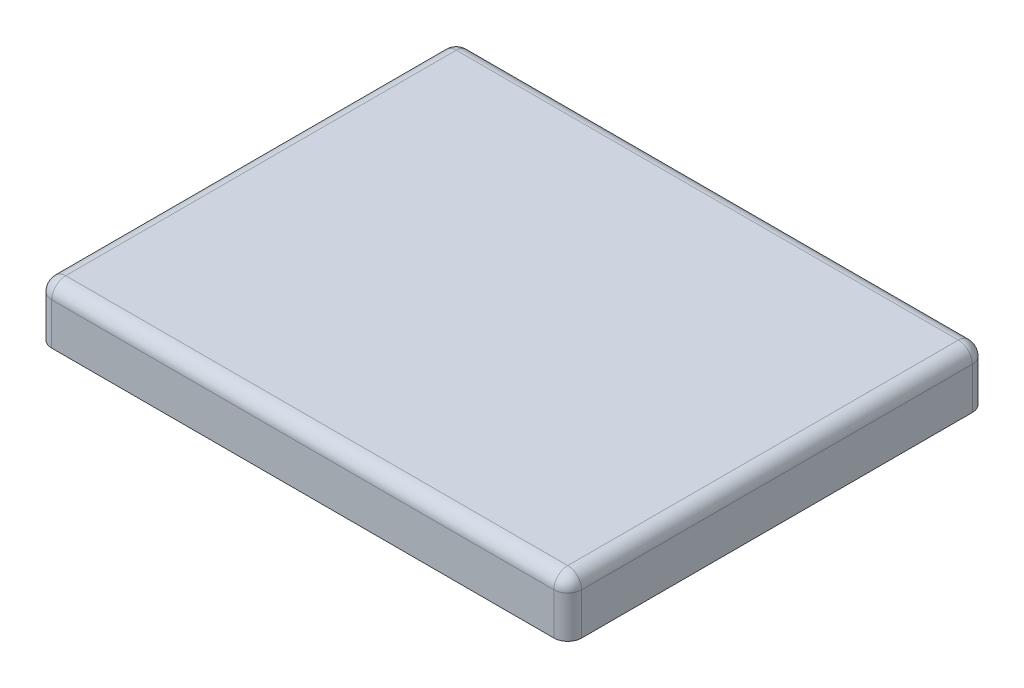
ISO-10303-21;
HEADER;
FILE_DESCRIPTION(('STEP AP214'),'2;1');
FILE_NAME('part.step','',(''),(''),'','','');
FILE_SCHEMA(('AUTOMOTIVE_DESIGN { 1 0 10303 214 1 1 1 1 }'));
ENDSEC;
DATA;
#1=APPLICATION_CONTEXT('core data for automotive mechanical design processes');
#2=APPLICATION_PROTOCOL_DEFINITION('international standard','automotive_design',2000,#1);
#3=PRODUCT_CONTEXT('',#1,'mechanical');
#4=PRODUCT('Part','Part','',(#3));
#5=PRODUCT_RELATED_PRODUCT_CATEGORY('part','',(#4));
#6=PRODUCT_DEFINITION_FORMATION('','',#4);
#7=PRODUCT_DEFINITION_CONTEXT('part definition',#1,'design');
#8=PRODUCT_DEFINITION('design','',#6,#7);
#9=PRODUCT_DEFINITION_SHAPE('','',#8);
#10=(LENGTH_UNIT() NAMED_UNIT(*) SI_UNIT(.MILLI.,.METRE.));
#11=(NAMED_UNIT(*) PLANE_ANGLE_UNIT() SI_UNIT($,.RADIAN.));
#12=(NAMED_UNIT(*) SI_UNIT($,.STERADIAN.) SOLID_ANGLE_UNIT());
#13=UNCERTAINTY_MEASURE_WITH_UNIT(LENGTH_MEASURE(1.E-05),#10,'distance_accuracy_value','');
#14=(GEOMETRIC_REPRESENTATION_CONTEXT(3) GLOBAL_UNCERTAINTY_ASSIGNED_CONTEXT((#13)) GLOBAL_UNIT_ASSIGNED_CONTEXT((#10,
#11,#12)) REPRESENTATION_CONTEXT('',''));
#15=CARTESIAN_POINT('',(0.,0.,0.));
#16=DIRECTION('',(0.,0.,1.));
#17=DIRECTION('',(1.,0.,0.));
#18=AXIS2_PLACEMENT_3D('',#15,#16,#17);
#19=CARTESIAN_POINT('',(0.,50.8,0.));
#20=DIRECTION('',(1.,0.,0.));
#21=DIRECTION('',(0.,0.,-1.));
#22=AXIS2_PLACEMENT_3D('',#19,#20,#21);
#23=PLANE('',#22);
#24=DIRECTION('',(0.,0.,1.));
#25=VECTOR('',#24,1.);
#26=CARTESIAN_POINT('',(0.,38.1,0.));
#27=LINE('',#26,#25);
#28=CARTESIAN_POINT('',(0.,38.1,-12.7));
#29=VERTEX_POINT('',#28);
#30=CARTESIAN_POINT('',(0.,38.1,-368.3));
#31=VERTEX_POINT('',#30);
#32=EDGE_CURVE('E128',#29,#31,#27,.F.);
#33=ORIENTED_EDGE('',*,*,#32,.T.);
#34=DIRECTION('',(0.,-1.,0.));
#35=VECTOR('',#34,1.);
#36=CARTESIAN_POINT('',(0.,50.8,-368.3));
#37=LINE('',#36,#35);
#38=CARTESIAN_POINT('',(0.,0.,-368.3));
#39=VERTEX_POINT('',#38);
#40=EDGE_CURVE('E114',#31,#39,#37,.T.);
#41=ORIENTED_EDGE('',*,*,#40,.T.);
#42=DIRECTION('',(0.,0.,1.));
#43=VECTOR('',#42,1.);
#44=CARTESIAN_POINT('',(0.,0.,0.));
#45=LINE('',#44,#43);
#46=CARTESIAN_POINT('',(0.,0.,-12.7));
#47=VERTEX_POINT('',#46);
#48=EDGE_CURVE('E125',#39,#47,#45,.T.);
#49=ORIENTED_EDGE('',*,*,#48,.T.);
#50=DIRECTION('',(0.,-1.,0.));
#51=VECTOR('',#50,1.);
#52=CARTESIAN_POINT('',(0.,50.8,-12.7));
#53=LINE('',#52,#51);
#54=EDGE_CURVE('E147',#47,#29,#53,.F.);
#55=ORIENTED_EDGE('',*,*,#54,.T.);
#56=EDGE_LOOP('',(#33,#41,#49,#55));
#57=FACE_BOUND('',#56,.T.);
#58=ADVANCED_FACE('F33',(#57),#23,.F.);
#59=CARTESIAN_POINT('',(0.,50.8,0.));
#60=DIRECTION('',(0.,0.,-1.));
#61=DIRECTION('',(-1.,0.,0.));
#62=AXIS2_PLACEMENT_3D('',#59,#60,#61);
#63=PLANE('',#62);
#64=DIRECTION('',(1.,0.,0.));
#65=VECTOR('',#64,1.);
#66=CARTESIAN_POINT('',(0.,38.1,0.));
#67=LINE('',#66,#65);
#68=CARTESIAN_POINT('',(469.9,38.1,0.));
#69=VERTEX_POINT('',#68);
#70=CARTESIAN_POINT('',(12.7,38.1,0.));
#71=VERTEX_POINT('',#70);
#72=EDGE_CURVE('E42',#69,#71,#67,.F.);
#73=ORIENTED_EDGE('',*,*,#72,.T.);
#74=DIRECTION('',(0.,-1.,0.));
#75=VECTOR('',#74,1.);
#76=CARTESIAN_POINT('',(12.7,50.8,0.));
#77=LINE('',#76,#75);
#78=CARTESIAN_POINT('',(12.7,0.,0.));
#79=VERTEX_POINT('',#78);
#80=EDGE_CURVE('E11',#71,#79,#77,.T.);
#81=ORIENTED_EDGE('',*,*,#80,.T.);
#82=DIRECTION('',(1.,0.,0.));
#83=VECTOR('',#82,1.);
#84=CARTESIAN_POINT('',(0.,0.,0.));
#85=LINE('',#84,#83);
#86=CARTESIAN_POINT('',(469.9,0.,0.));
#87=VERTEX_POINT('',#86);
#88=EDGE_CURVE('E136',#79,#87,#85,.T.);
#89=ORIENTED_EDGE('',*,*,#88,.T.);
#90=DIRECTION('',(0.,-1.,0.));
#91=VECTOR('',#90,1.);
#92=CARTESIAN_POINT('',(469.9,50.8,0.));
#93=LINE('',#92,#91);
#94=EDGE_CURVE('E53',#87,#69,#93,.F.);
#95=ORIENTED_EDGE('',*,*,#94,.T.);
#96=EDGE_LOOP('',(#73,#81,#89,#95));
#97=FACE_BOUND('',#96,.T.);
#98=ADVANCED_FACE('F244',(#97),#63,.F.);
#99=CARTESIAN_POINT('',(482.6,50.8,0.));
#100=DIRECTION('',(-1.,0.,0.));
#101=DIRECTION('',(0.,0.,1.));
#102=AXIS2_PLACEMENT_3D('',#99,#100,#101);
#103=PLANE('',#102);
#104=DIRECTION('',(0.,0.,-1.));
#105=VECTOR('',#104,1.);
#106=CARTESIAN_POINT('',(482.6,0.,0.));
#107=LINE('',#106,#105);
#108=CARTESIAN_POINT('',(482.6,0.,-12.7));
#109=VERTEX_POINT('',#108);
#110=CARTESIAN_POINT('',(482.6,0.,-368.3));
#111=VERTEX_POINT('',#110);
#112=EDGE_CURVE('E138',#109,#111,#107,.T.);
#113=ORIENTED_EDGE('',*,*,#112,.T.);
#114=DIRECTION('',(0.,-1.,0.));
#115=VECTOR('',#114,1.);
#116=CARTESIAN_POINT('',(482.6,50.8,-368.3));
#117=LINE('',#116,#115);
#118=CARTESIAN_POINT('',(482.6,38.1,-368.3));
#119=VERTEX_POINT('',#118);
#120=EDGE_CURVE('E161',#111,#119,#117,.F.);
#121=ORIENTED_EDGE('',*,*,#120,.T.);
#122=DIRECTION('',(0.,0.,-1.));
#123=VECTOR('',#122,1.);
#124=CARTESIAN_POINT('',(482.6,38.1,0.));
#125=LINE('',#124,#123);
#126=CARTESIAN_POINT('',(482.6,38.1,-12.7));
#127=VERTEX_POINT('',#126);
#128=EDGE_CURVE('E159',#119,#127,#125,.F.);
#129=ORIENTED_EDGE('',*,*,#128,.T.);
#130=DIRECTION('',(0.,-1.,0.));
#131=VECTOR('',#130,1.);
#132=CARTESIAN_POINT('',(482.6,50.8,-12.7));
#133=LINE('',#132,#131);
#134=EDGE_CURVE('E157',#127,#109,#133,.T.);
#135=ORIENTED_EDGE('',*,*,#134,.T.);
#136=EDGE_LOOP('',(#113,#121,#129,#135));
#137=FACE_BOUND('',#136,.T.);
#138=ADVANCED_FACE('F217',(#137),#103,.F.);
#139=CARTESIAN_POINT('',(0.,50.8,-381.));
#140=DIRECTION('',(0.,0.,1.));
#141=DIRECTION('',(1.,0.,0.));
#142=AXIS2_PLACEMENT_3D('',#139,#140,#141);
#143=PLANE('',#142);
#144=DIRECTION('',(-1.,0.,0.));
#145=VECTOR('',#144,1.);
#146=CARTESIAN_POINT('',(0.,0.,-381.));
#147=LINE('',#146,#145);
#148=CARTESIAN_POINT('',(469.9,0.,-381.));
#149=VERTEX_POINT('',#148);
#150=CARTESIAN_POINT('',(12.7,0.,-381.));
#151=VERTEX_POINT('',#150);
#152=EDGE_CURVE('E145',#149,#151,#147,.T.);
#153=ORIENTED_EDGE('',*,*,#152,.T.);
#154=DIRECTION('',(0.,-1.,0.));
#155=VECTOR('',#154,1.);
#156=CARTESIAN_POINT('',(12.7,50.8,-381.));
#157=LINE('',#156,#155);
#158=CARTESIAN_POINT('',(12.7,38.1,-381.));
#159=VERTEX_POINT('',#158);
#160=EDGE_CURVE('E115',#151,#159,#157,.F.);
#161=ORIENTED_EDGE('',*,*,#160,.T.);
#162=DIRECTION('',(-1.,0.,0.));
#163=VECTOR('',#162,1.);
#164=CARTESIAN_POINT('',(0.,38.1,-381.));
#165=LINE('',#164,#163);
#166=CARTESIAN_POINT('',(469.9,38.1,-381.));
#167=VERTEX_POINT('',#166);
#168=EDGE_CURVE('E120',#159,#167,#165,.F.);
#169=ORIENTED_EDGE('',*,*,#168,.T.);
#170=DIRECTION('',(0.,-1.,0.));
#171=VECTOR('',#170,1.);
#172=CARTESIAN_POINT('',(469.9,50.8,-381.));
#173=LINE('',#172,#171);
#174=EDGE_CURVE('E154',#167,#149,#173,.T.);
#175=ORIENTED_EDGE('',*,*,#174,.T.);
#176=EDGE_LOOP('',(#153,#161,#169,#175));
#177=FACE_BOUND('',#176,.T.);
#178=ADVANCED_FACE('F251',(#177),#143,.F.);
#179=CARTESIAN_POINT('',(0.,50.8,-381.));
#180=DIRECTION('',(0.,-1.,0.));
#181=DIRECTION('',(0.,0.,-1.));
#182=AXIS2_PLACEMENT_3D('',#179,#180,#181);
#183=PLANE('',#182);
#184=DIRECTION('',(0.,0.,-1.));
#185=VECTOR('',#184,1.);
#186=CARTESIAN_POINT('',(469.9,50.8,-381.));
#187=LINE('',#186,#185);
#188=CARTESIAN_POINT('',(469.9,50.8,-12.7));
#189=VERTEX_POINT('',#188);
#190=CARTESIAN_POINT('',(469.9,50.8,-368.3));
#191=VERTEX_POINT('',#190);
#192=EDGE_CURVE('E163',#189,#191,#187,.T.);
#193=ORIENTED_EDGE('',*,*,#192,.T.);
#194=DIRECTION('',(-1.,0.,0.));
#195=VECTOR('',#194,1.);
#196=CARTESIAN_POINT('',(0.,50.8,-368.3));
#197=LINE('',#196,#195);
#198=CARTESIAN_POINT('',(12.7,50.8,-368.3));
#199=VERTEX_POINT('',#198);
#200=EDGE_CURVE('E169',#191,#199,#197,.T.);
#201=ORIENTED_EDGE('',*,*,#200,.T.);
#202=DIRECTION('',(0.,0.,1.));
#203=VECTOR('',#202,1.);
#204=CARTESIAN_POINT('',(12.7,50.8,-381.));
#205=LINE('',#204,#203);
#206=CARTESIAN_POINT('',(12.7,50.8,-12.7));
#207=VERTEX_POINT('',#206);
#208=EDGE_CURVE('E167',#199,#207,#205,.T.);
#209=ORIENTED_EDGE('',*,*,#208,.T.);
#210=DIRECTION('',(1.,0.,0.));
#211=VECTOR('',#210,1.);
#212=CARTESIAN_POINT('',(0.,50.8,-12.7));
#213=LINE('',#212,#211);
#214=EDGE_CURVE('E165',#207,#189,#213,.T.);
#215=ORIENTED_EDGE('',*,*,#214,.T.);
#216=EDGE_LOOP('',(#193,#201,#209,#215));
#217=FACE_BOUND('',#216,.T.);
#218=ADVANCED_FACE('F233',(#217),#183,.F.);
#219=CARTESIAN_POINT('',(0.,0.,-381.));
#220=DIRECTION('',(0.,-1.,0.));
#221=DIRECTION('',(0.,0.,-1.));
#222=AXIS2_PLACEMENT_3D('',#219,#220,#221);
#223=PLANE('',#222);
#224=ORIENTED_EDGE('',*,*,#48,.F.);
#225=CARTESIAN_POINT('',(12.7,0.,-368.3));
#226=DIRECTION('',(0.,-1.,0.));
#227=DIRECTION('',(0.,0.,-1.));
#228=AXIS2_PLACEMENT_3D('',#225,#226,#227);
#229=CIRCLE('',#228,12.7);
#230=EDGE_CURVE('E110',#39,#151,#229,.T.);
#231=ORIENTED_EDGE('',*,*,#230,.T.);
#232=ORIENTED_EDGE('',*,*,#152,.F.);
#233=CARTESIAN_POINT('',(469.9,0.,-368.3));
#234=DIRECTION('',(0.,-1.,0.));
#235=DIRECTION('',(0.,0.,-1.));
#236=AXIS2_PLACEMENT_3D('',#233,#234,#235);
#237=CIRCLE('',#236,12.7);
#238=EDGE_CURVE('E121',#149,#111,#237,.T.);
#239=ORIENTED_EDGE('',*,*,#238,.T.);
#240=ORIENTED_EDGE('',*,*,#112,.F.);
#241=CARTESIAN_POINT('',(469.9,0.,-12.7));
#242=DIRECTION('',(0.,-1.,0.));
#243=DIRECTION('',(0.,0.,-1.));
#244=AXIS2_PLACEMENT_3D('',#241,#242,#243);
#245=CIRCLE('',#244,12.7);
#246=EDGE_CURVE('E130',#109,#87,#245,.T.);
#247=ORIENTED_EDGE('',*,*,#246,.T.);
#248=ORIENTED_EDGE('',*,*,#88,.F.);
#249=CARTESIAN_POINT('',(12.7,0.,-12.7));
#250=DIRECTION('',(0.,-1.,0.));
#251=DIRECTION('',(0.,0.,-1.));
#252=AXIS2_PLACEMENT_3D('',#249,#250,#251);
#253=CIRCLE('',#252,12.7);
#254=EDGE_CURVE('E135',#79,#47,#253,.T.);
#255=ORIENTED_EDGE('',*,*,#254,.T.);
#256=EDGE_LOOP('',(#224,#231,#232,#239,#240,#247,#248,#255));
#257=FACE_BOUND('',#256,.T.);
#258=ADVANCED_FACE('F132',(#257),#223,.T.);
#259=CARTESIAN_POINT('',(469.9,50.8,-12.7));
#260=DIRECTION('',(0.,-1.,0.));
#261=DIRECTION('',(0.,0.,-1.));
#262=AXIS2_PLACEMENT_3D('',#259,#260,#261);
#263=CYLINDRICAL_SURFACE('',#262,12.7);
#264=CARTESIAN_POINT('',(469.9,38.1,-12.7));
#265=DIRECTION('',(0.,1.,0.));
#266=DIRECTION('',(0.,0.,1.));
#267=AXIS2_PLACEMENT_3D('',#264,#265,#266);
#268=CIRCLE('',#267,12.7);
#269=EDGE_CURVE('E37',#69,#127,#268,.T.);
#270=ORIENTED_EDGE('',*,*,#269,.F.);
#271=ORIENTED_EDGE('',*,*,#94,.F.);
#272=ORIENTED_EDGE('',*,*,#246,.F.);
#273=ORIENTED_EDGE('',*,*,#134,.F.);
#274=EDGE_LOOP('',(#270,#271,#272,#273));
#275=FACE_BOUND('',#274,.T.);
#276=ADVANCED_FACE('F35',(#275),#263,.T.);
#277=CARTESIAN_POINT('',(469.9,38.1,-12.7));
#278=DIRECTION('',(0.,0.,1.));
#279=DIRECTION('',(1.,0.,0.));
#280=AXIS2_PLACEMENT_3D('',#277,#278,#279);
#281=SPHERICAL_SURFACE('',#280,12.7);
#282=CARTESIAN_POINT('',(469.9,38.1,-12.7));
#283=DIRECTION('',(1.,0.,0.));
#284=DIRECTION('',(0.,0.,-1.));
#285=AXIS2_PLACEMENT_3D('',#282,#283,#284);
#286=CIRCLE('',#285,12.7);
#287=EDGE_CURVE('E199',#69,#189,#286,.F.);
#288=ORIENTED_EDGE('',*,*,#287,.F.);
#289=ORIENTED_EDGE('',*,*,#269,.T.);
#290=CARTESIAN_POINT('',(469.9,38.1,-12.7));
#291=DIRECTION('',(0.,0.,1.));
#292=DIRECTION('',(0.,-1.,0.));
#293=AXIS2_PLACEMENT_3D('',#290,#291,#292);
#294=CIRCLE('',#293,12.7);
#295=EDGE_CURVE('E141',#189,#127,#294,.F.);
#296=ORIENTED_EDGE('',*,*,#295,.F.);
#297=EDGE_LOOP('',(#288,#289,#296));
#298=FACE_BOUND('',#297,.T.);
#299=ADVANCED_FACE('F211',(#298),#281,.T.);
#300=CARTESIAN_POINT('',(469.9,50.8,-368.3));
#301=DIRECTION('',(0.,-1.,0.));
#302=DIRECTION('',(0.,0.,-1.));
#303=AXIS2_PLACEMENT_3D('',#300,#301,#302);
#304=CYLINDRICAL_SURFACE('',#303,12.7);
#305=ORIENTED_EDGE('',*,*,#238,.F.);
#306=ORIENTED_EDGE('',*,*,#174,.F.);
#307=CARTESIAN_POINT('',(469.9,38.1,-368.3));
#308=DIRECTION('',(0.,1.,0.));
#309=DIRECTION('',(0.,0.,1.));
#310=AXIS2_PLACEMENT_3D('',#307,#308,#309);
#311=CIRCLE('',#310,12.7);
#312=EDGE_CURVE('E196',#119,#167,#311,.T.);
#313=ORIENTED_EDGE('',*,*,#312,.F.);
#314=ORIENTED_EDGE('',*,*,#120,.F.);
#315=EDGE_LOOP('',(#305,#306,#313,#314));
#316=FACE_BOUND('',#315,.T.);
#317=ADVANCED_FACE('F222',(#316),#304,.T.);
#318=CARTESIAN_POINT('',(469.9,38.1,-381.));
#319=DIRECTION('',(0.,0.,-1.));
#320=DIRECTION('',(-1.,0.,0.));
#321=AXIS2_PLACEMENT_3D('',#318,#319,#320);
#322=CYLINDRICAL_SURFACE('',#321,12.7);
#323=ORIENTED_EDGE('',*,*,#295,.T.);
#324=ORIENTED_EDGE('',*,*,#128,.F.);
#325=CARTESIAN_POINT('',(469.9,38.1,-368.3));
#326=DIRECTION('',(0.,0.,-1.));
#327=DIRECTION('',(-1.,0.,0.));
#328=AXIS2_PLACEMENT_3D('',#325,#326,#327);
#329=CIRCLE('',#328,12.7);
#330=EDGE_CURVE('E193',#191,#119,#329,.T.);
#331=ORIENTED_EDGE('',*,*,#330,.F.);
#332=ORIENTED_EDGE('',*,*,#192,.F.);
#333=EDGE_LOOP('',(#323,#324,#331,#332));
#334=FACE_BOUND('',#333,.T.);
#335=ADVANCED_FACE('F206',(#334),#322,.T.);
#336=CARTESIAN_POINT('',(0.,38.1,-12.7));
#337=DIRECTION('',(1.,0.,0.));
#338=DIRECTION('',(0.,0.,-1.));
#339=AXIS2_PLACEMENT_3D('',#336,#337,#338);
#340=CYLINDRICAL_SURFACE('',#339,12.7);
#341=ORIENTED_EDGE('',*,*,#287,.T.);
#342=ORIENTED_EDGE('',*,*,#214,.F.);
#343=CARTESIAN_POINT('',(12.7,38.1,-12.7));
#344=DIRECTION('',(-1.,0.,0.));
#345=DIRECTION('',(0.,0.,1.));
#346=AXIS2_PLACEMENT_3D('',#343,#344,#345);
#347=CIRCLE('',#346,12.7);
#348=EDGE_CURVE('E190',#71,#207,#347,.T.);
#349=ORIENTED_EDGE('',*,*,#348,.F.);
#350=ORIENTED_EDGE('',*,*,#72,.F.);
#351=EDGE_LOOP('',(#341,#342,#349,#350));
#352=FACE_BOUND('',#351,.T.);
#353=ADVANCED_FACE('F237',(#352),#340,.T.);
#354=CARTESIAN_POINT('',(12.7,50.8,-12.7));
#355=DIRECTION('',(0.,-1.,0.));
#356=DIRECTION('',(0.,0.,-1.));
#357=AXIS2_PLACEMENT_3D('',#354,#355,#356);
#358=CYLINDRICAL_SURFACE('',#357,12.7);
#359=ORIENTED_EDGE('',*,*,#254,.F.);
#360=ORIENTED_EDGE('',*,*,#80,.F.);
#361=CARTESIAN_POINT('',(12.7,38.1,-12.7));
#362=DIRECTION('',(0.,1.,0.));
#363=DIRECTION('',(0.,0.,1.));
#364=AXIS2_PLACEMENT_3D('',#361,#362,#363);
#365=CIRCLE('',#364,12.7);
#366=EDGE_CURVE('E187',#29,#71,#365,.T.);
#367=ORIENTED_EDGE('',*,*,#366,.F.);
#368=ORIENTED_EDGE('',*,*,#54,.F.);
#369=EDGE_LOOP('',(#359,#360,#367,#368));
#370=FACE_BOUND('',#369,.T.);
#371=ADVANCED_FACE('F243',(#370),#358,.T.);
#372=CARTESIAN_POINT('',(469.9,38.1,-368.3));
#373=DIRECTION('',(0.,0.,1.));
#374=DIRECTION('',(1.,0.,0.));
#375=AXIS2_PLACEMENT_3D('',#372,#373,#374);
#376=SPHERICAL_SURFACE('',#375,12.7);
#377=ORIENTED_EDGE('',*,*,#330,.T.);
#378=ORIENTED_EDGE('',*,*,#312,.T.);
#379=CARTESIAN_POINT('',(469.9,38.1,-368.3));
#380=DIRECTION('',(1.,0.,0.));
#381=DIRECTION('',(0.,0.,-1.));
#382=AXIS2_PLACEMENT_3D('',#379,#380,#381);
#383=CIRCLE('',#382,12.7);
#384=EDGE_CURVE('E184',#191,#167,#383,.F.);
#385=ORIENTED_EDGE('',*,*,#384,.F.);
#386=EDGE_LOOP('',(#377,#378,#385));
#387=FACE_BOUND('',#386,.T.);
#388=ADVANCED_FACE('F225',(#387),#376,.T.);
#389=CARTESIAN_POINT('',(12.7,38.1,-12.7));
#390=DIRECTION('',(0.,0.,1.));
#391=DIRECTION('',(1.,0.,0.));
#392=AXIS2_PLACEMENT_3D('',#389,#390,#391);
#393=SPHERICAL_SURFACE('',#392,12.7);
#394=ORIENTED_EDGE('',*,*,#366,.T.);
#395=ORIENTED_EDGE('',*,*,#348,.T.);
#396=CARTESIAN_POINT('',(12.7,38.1,-12.7));
#397=DIRECTION('',(0.,0.,1.));
#398=DIRECTION('',(1.,0.,0.));
#399=AXIS2_PLACEMENT_3D('',#396,#397,#398);
#400=CIRCLE('',#399,12.7);
#401=EDGE_CURVE('E181',#29,#207,#400,.F.);
#402=ORIENTED_EDGE('',*,*,#401,.F.);
#403=EDGE_LOOP('',(#394,#395,#402));
#404=FACE_BOUND('',#403,.T.);
#405=ADVANCED_FACE('F241',(#404),#393,.T.);
#406=CARTESIAN_POINT('',(0.,38.1,-368.3));
#407=DIRECTION('',(-1.,0.,0.));
#408=DIRECTION('',(0.,0.,1.));
#409=AXIS2_PLACEMENT_3D('',#406,#407,#408);
#410=CYLINDRICAL_SURFACE('',#409,12.7);
#411=ORIENTED_EDGE('',*,*,#384,.T.);
#412=ORIENTED_EDGE('',*,*,#168,.F.);
#413=CARTESIAN_POINT('',(12.7,38.1,-368.3));
#414=DIRECTION('',(-1.,0.,0.));
#415=DIRECTION('',(0.,0.,1.));
#416=AXIS2_PLACEMENT_3D('',#413,#414,#415);
#417=CIRCLE('',#416,12.7);
#418=EDGE_CURVE('E178',#199,#159,#417,.T.);
#419=ORIENTED_EDGE('',*,*,#418,.F.);
#420=ORIENTED_EDGE('',*,*,#200,.F.);
#421=EDGE_LOOP('',(#411,#412,#419,#420));
#422=FACE_BOUND('',#421,.T.);
#423=ADVANCED_FACE('F230',(#422),#410,.T.);
#424=CARTESIAN_POINT('',(12.7,38.1,-381.));
#425=DIRECTION('',(0.,0.,1.));
#426=DIRECTION('',(1.,0.,0.));
#427=AXIS2_PLACEMENT_3D('',#424,#425,#426);
#428=CYLINDRICAL_SURFACE('',#427,12.7);
#429=ORIENTED_EDGE('',*,*,#401,.T.);
#430=ORIENTED_EDGE('',*,*,#208,.F.);
#431=CARTESIAN_POINT('',(12.7,38.1,-368.3));
#432=DIRECTION('',(0.,0.,-1.));
#433=DIRECTION('',(-1.,0.,0.));
#434=AXIS2_PLACEMENT_3D('',#431,#432,#433);
#435=CIRCLE('',#434,12.7);
#436=EDGE_CURVE('E176',#31,#199,#435,.T.);
#437=ORIENTED_EDGE('',*,*,#436,.F.);
#438=ORIENTED_EDGE('',*,*,#32,.F.);
#439=EDGE_LOOP('',(#429,#430,#437,#438));
#440=FACE_BOUND('',#439,.T.);
#441=ADVANCED_FACE('F261',(#440),#428,.T.);
#442=CARTESIAN_POINT('',(12.7,38.1,-368.3));
#443=DIRECTION('',(0.,0.,1.));
#444=DIRECTION('',(1.,0.,0.));
#445=AXIS2_PLACEMENT_3D('',#442,#443,#444);
#446=SPHERICAL_SURFACE('',#445,12.7);
#447=ORIENTED_EDGE('',*,*,#436,.T.);
#448=ORIENTED_EDGE('',*,*,#418,.T.);
#449=CARTESIAN_POINT('',(12.7,38.1,-368.3));
#450=DIRECTION('',(0.,1.,0.));
#451=DIRECTION('',(0.,0.,1.));
#452=AXIS2_PLACEMENT_3D('',#449,#450,#451);
#453=CIRCLE('',#452,12.7);
#454=EDGE_CURVE('E174',#31,#159,#453,.F.);
#455=ORIENTED_EDGE('',*,*,#454,.F.);
#456=EDGE_LOOP('',(#447,#448,#455));
#457=FACE_BOUND('',#456,.T.);
#458=ADVANCED_FACE('F258',(#457),#446,.T.);
#459=CARTESIAN_POINT('',(12.7,50.8,-368.3));
#460=DIRECTION('',(0.,-1.,0.));
#461=DIRECTION('',(0.,0.,-1.));
#462=AXIS2_PLACEMENT_3D('',#459,#460,#461);
#463=CYLINDRICAL_SURFACE('',#462,12.7);
#464=ORIENTED_EDGE('',*,*,#454,.T.);
#465=ORIENTED_EDGE('',*,*,#160,.F.);
#466=ORIENTED_EDGE('',*,*,#230,.F.);
#467=ORIENTED_EDGE('',*,*,#40,.F.);
#468=EDGE_LOOP('',(#464,#465,#466,#467));
#469=FACE_BOUND('',#468,.T.);
#470=ADVANCED_FACE('F113',(#469),#463,.T.);
#471=CLOSED_SHELL('',(#58,#98,#138,#178,#218,#258,#276,#299,#317,#335,#353,#371,#388,#405,#423,
#441,#458,#470));
#472=MANIFOLD_SOLID_BREP('B2',#471);
#473=ADVANCED_BREP_SHAPE_REPRESENTATION('',(#18,#472),#14);
#474=SHAPE_DEFINITION_REPRESENTATION(#9,#473);
ENDSEC;
END-ISO-10303-21;
